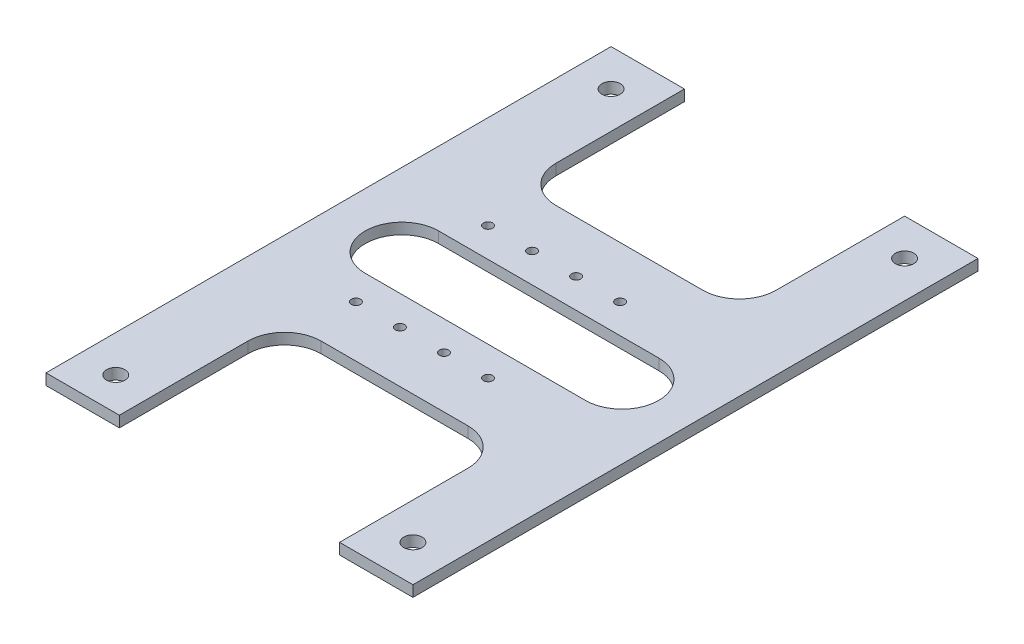
ISO-10303-21;
HEADER;
FILE_DESCRIPTION(('STEP AP214'),'2;1');
FILE_NAME('part.step','',(''),(''),'','','');
FILE_SCHEMA(('AUTOMOTIVE_DESIGN { 1 0 10303 214 1 1 1 1 }'));
ENDSEC;
DATA;
#1=APPLICATION_CONTEXT('core data for automotive mechanical design processes');
#2=APPLICATION_PROTOCOL_DEFINITION('international standard','automotive_design',2000,#1);
#3=PRODUCT_CONTEXT('',#1,'mechanical');
#4=PRODUCT('Part','Part','',(#3));
#5=PRODUCT_RELATED_PRODUCT_CATEGORY('part','',(#4));
#6=PRODUCT_DEFINITION_FORMATION('','',#4);
#7=PRODUCT_DEFINITION_CONTEXT('part definition',#1,'design');
#8=PRODUCT_DEFINITION('design','',#6,#7);
#9=PRODUCT_DEFINITION_SHAPE('','',#8);
#10=(LENGTH_UNIT() NAMED_UNIT(*) SI_UNIT(.MILLI.,.METRE.));
#11=(NAMED_UNIT(*) PLANE_ANGLE_UNIT() SI_UNIT($,.RADIAN.));
#12=(NAMED_UNIT(*) SI_UNIT($,.STERADIAN.) SOLID_ANGLE_UNIT());
#13=UNCERTAINTY_MEASURE_WITH_UNIT(LENGTH_MEASURE(1.E-05),#10,'distance_accuracy_value','');
#14=(GEOMETRIC_REPRESENTATION_CONTEXT(3) GLOBAL_UNCERTAINTY_ASSIGNED_CONTEXT((#13)) GLOBAL_UNIT_ASSIGNED_CONTEXT((#10,
#11,#12)) REPRESENTATION_CONTEXT('',''));
#15=CARTESIAN_POINT('',(0.,0.,0.));
#16=DIRECTION('',(0.,0.,1.));
#17=DIRECTION('',(1.,0.,0.));
#18=AXIS2_PLACEMENT_3D('',#15,#16,#17);
#19=CARTESIAN_POINT('',(944.32799999999,-12.6918888385529,232.973817187622));
#20=DIRECTION('',(0.,0.,-1.));
#21=DIRECTION('',(-1.,0.,0.));
#22=AXIS2_PLACEMENT_3D('',#19,#20,#21);
#23=PLANE('',#22);
#24=DIRECTION('',(1.,0.,0.));
#25=VECTOR('',#24,1.);
#26=CARTESIAN_POINT('',(944.32799999999,-15.6918888385529,232.973817187622));
#27=LINE('',#26,#25);
#28=CARTESIAN_POINT('',(944.32799999999,-15.6918888385529,232.973817187622));
#29=VERTEX_POINT('',#28);
#30=CARTESIAN_POINT('',(964.32799999999,-15.6918888385529,232.973817187622));
#31=VERTEX_POINT('',#30);
#32=EDGE_CURVE('E347',#29,#31,#27,.T.);
#33=ORIENTED_EDGE('',*,*,#32,.T.);
#34=DIRECTION('',(0.,1.,0.));
#35=VECTOR('',#34,1.);
#36=CARTESIAN_POINT('',(964.32799999999,-12.6918888385529,232.973817187622));
#37=LINE('',#36,#35);
#38=CARTESIAN_POINT('',(964.32799999999,-12.6918888385529,232.973817187622));
#39=VERTEX_POINT('',#38);
#40=EDGE_CURVE('E375',#31,#39,#37,.T.);
#41=ORIENTED_EDGE('',*,*,#40,.T.);
#42=DIRECTION('',(1.,0.,0.));
#43=VECTOR('',#42,1.);
#44=CARTESIAN_POINT('',(944.32799999999,-12.6918888385529,232.973817187622));
#45=LINE('',#44,#43);
#46=CARTESIAN_POINT('',(944.32799999999,-12.6918888385529,232.973817187622));
#47=VERTEX_POINT('',#46);
#48=EDGE_CURVE('E334',#47,#39,#45,.T.);
#49=ORIENTED_EDGE('',*,*,#48,.F.);
#50=DIRECTION('',(0.,-1.,0.));
#51=VECTOR('',#50,1.);
#52=CARTESIAN_POINT('',(944.32799999999,-12.6918888385529,232.973817187622));
#53=LINE('',#52,#51);
#54=EDGE_CURVE('E363',#47,#29,#53,.T.);
#55=ORIENTED_EDGE('',*,*,#54,.T.);
#56=EDGE_LOOP('',(#33,#41,#49,#55));
#57=FACE_BOUND('',#56,.T.);
#58=ADVANCED_FACE('F35',(#57),#23,.F.);
#59=CARTESIAN_POINT('',(944.32799999999,-12.6918888385529,78.9738171876227));
#60=DIRECTION('',(0.,0.,1.));
#61=DIRECTION('',(1.,0.,0.));
#62=AXIS2_PLACEMENT_3D('',#59,#60,#61);
#63=PLANE('',#62);
#64=DIRECTION('',(-1.,0.,0.));
#65=VECTOR('',#64,1.);
#66=CARTESIAN_POINT('',(944.32799999999,-12.6918888385529,78.9738171876227));
#67=LINE('',#66,#65);
#68=CARTESIAN_POINT('',(964.32799999999,-12.6918888385529,78.9738171876227));
#69=VERTEX_POINT('',#68);
#70=CARTESIAN_POINT('',(944.32799999999,-12.6918888385529,78.9738171876227));
#71=VERTEX_POINT('',#70);
#72=EDGE_CURVE('E339',#69,#71,#67,.T.);
#73=ORIENTED_EDGE('',*,*,#72,.F.);
#74=DIRECTION('',(0.,-1.,0.));
#75=VECTOR('',#74,1.);
#76=CARTESIAN_POINT('',(964.32799999999,-12.6918888385529,78.9738171876227));
#77=LINE('',#76,#75);
#78=CARTESIAN_POINT('',(964.32799999999,-15.6918888385529,78.9738171876227));
#79=VERTEX_POINT('',#78);
#80=EDGE_CURVE('E369',#69,#79,#77,.T.);
#81=ORIENTED_EDGE('',*,*,#80,.T.);
#82=DIRECTION('',(-1.,0.,0.));
#83=VECTOR('',#82,1.);
#84=CARTESIAN_POINT('',(944.32799999999,-15.6918888385529,78.9738171876227));
#85=LINE('',#84,#83);
#86=CARTESIAN_POINT('',(944.32799999999,-15.6918888385529,78.9738171876227));
#87=VERTEX_POINT('',#86);
#88=EDGE_CURVE('E352',#79,#87,#85,.T.);
#89=ORIENTED_EDGE('',*,*,#88,.T.);
#90=DIRECTION('',(0.,-1.,0.));
#91=VECTOR('',#90,1.);
#92=CARTESIAN_POINT('',(944.32799999999,-12.6918888385529,78.9738171876227));
#93=LINE('',#92,#91);
#94=EDGE_CURVE('E343',#71,#87,#93,.T.);
#95=ORIENTED_EDGE('',*,*,#94,.F.);
#96=EDGE_LOOP('',(#73,#81,#89,#95));
#97=FACE_BOUND('',#96,.T.);
#98=ADVANCED_FACE('F420',(#97),#63,.F.);
#99=CARTESIAN_POINT('',(0.,-12.6918888385529,0.));
#100=DIRECTION('',(0.,1.,0.));
#101=DIRECTION('',(0.,0.,1.));
#102=AXIS2_PLACEMENT_3D('',#99,#100,#101);
#103=PLANE('',#102);
#104=CARTESIAN_POINT('',(964.32799999999,-12.6918888385529,155.973817187622));
#105=DIRECTION('',(0.,1.,0.));
#106=DIRECTION('',(0.,0.,1.));
#107=AXIS2_PLACEMENT_3D('',#104,#105,#106);
#108=CIRCLE('',#107,10.);
#109=CARTESIAN_POINT('',(964.32799999999,-12.6918888385529,145.973817187622));
#110=VERTEX_POINT('',#109);
#111=CARTESIAN_POINT('',(964.32799999999,-12.6918888385529,165.973817187622));
#112=VERTEX_POINT('',#111);
#113=EDGE_CURVE('E50',#110,#112,#108,.T.);
#114=ORIENTED_EDGE('',*,*,#113,.F.);
#115=DIRECTION('',(-1.,0.,0.));
#116=VECTOR('',#115,1.);
#117=CARTESIAN_POINT('',(964.32799999999,-12.6918888385529,145.973817187622));
#118=LINE('',#117,#116);
#119=CARTESIAN_POINT('',(1024.32799999999,-12.6918888385529,145.973817187622));
#120=VERTEX_POINT('',#119);
#121=EDGE_CURVE('E191',#120,#110,#118,.T.);
#122=ORIENTED_EDGE('',*,*,#121,.F.);
#123=CARTESIAN_POINT('',(1024.32799999999,-12.6918888385529,155.973817187622));
#124=DIRECTION('',(0.,1.,0.));
#125=DIRECTION('',(0.,0.,1.));
#126=AXIS2_PLACEMENT_3D('',#123,#124,#125);
#127=CIRCLE('',#126,10.);
#128=CARTESIAN_POINT('',(1024.32799999999,-12.6918888385529,165.973817187622));
#129=VERTEX_POINT('',#128);
#130=EDGE_CURVE('E175',#129,#120,#127,.T.);
#131=ORIENTED_EDGE('',*,*,#130,.F.);
#132=DIRECTION('',(1.,0.,0.));
#133=VECTOR('',#132,1.);
#134=CARTESIAN_POINT('',(964.32799999999,-12.6918888385529,165.973817187622));
#135=LINE('',#134,#133);
#136=EDGE_CURVE('E184',#112,#129,#135,.T.);
#137=ORIENTED_EDGE('',*,*,#136,.F.);
#138=EDGE_LOOP('',(#114,#122,#131,#137));
#139=FACE_BOUND('',#138,.T.);
#140=DIRECTION('',(0.,0.,1.));
#141=VECTOR('',#140,1.);
#142=CARTESIAN_POINT('',(964.32799999999,-12.6918888385529,78.8756281646974));
#143=LINE('',#142,#141);
#144=CARTESIAN_POINT('',(964.32799999999,-12.6918888385529,113.973817187623));
#145=VERTEX_POINT('',#144);
#146=EDGE_CURVE('E201',#69,#145,#143,.T.);
#147=ORIENTED_EDGE('',*,*,#146,.F.);
#148=ORIENTED_EDGE('',*,*,#72,.T.);
#149=DIRECTION('',(0.,0.,1.));
#150=VECTOR('',#149,1.);
#151=CARTESIAN_POINT('',(944.32799999999,-12.6918888385529,78.9738171876227));
#152=LINE('',#151,#150);
#153=EDGE_CURVE('E329',#71,#47,#152,.T.);
#154=ORIENTED_EDGE('',*,*,#153,.T.);
#155=ORIENTED_EDGE('',*,*,#48,.T.);
#156=DIRECTION('',(0.,0.,1.));
#157=VECTOR('',#156,1.);
#158=CARTESIAN_POINT('',(964.32799999999,-12.6918888385529,238.398898184874));
#159=LINE('',#158,#157);
#160=CARTESIAN_POINT('',(964.32799999999,-12.6918888385529,197.973817187622));
#161=VERTEX_POINT('',#160);
#162=EDGE_CURVE('E198',#161,#39,#159,.T.);
#163=ORIENTED_EDGE('',*,*,#162,.F.);
#164=CARTESIAN_POINT('',(974.32799999999,-12.6918888385529,197.973817187622));
#165=DIRECTION('',(0.,1.,0.));
#166=DIRECTION('',(0.,0.,-1.));
#167=AXIS2_PLACEMENT_3D('',#164,#165,#166);
#168=CIRCLE('',#167,10.);
#169=CARTESIAN_POINT('',(974.32799999999,-12.6918888385529,187.973817187622));
#170=VERTEX_POINT('',#169);
#171=EDGE_CURVE('E235',#170,#161,#168,.T.);
#172=ORIENTED_EDGE('',*,*,#171,.F.);
#173=DIRECTION('',(-1.,0.,0.));
#174=VECTOR('',#173,1.);
#175=CARTESIAN_POINT('',(974.32799999999,-12.6918888385529,187.973817187622));
#176=LINE('',#175,#174);
#177=CARTESIAN_POINT('',(1014.32799999999,-12.6918888385529,187.973817187622));
#178=VERTEX_POINT('',#177);
#179=EDGE_CURVE('E232',#178,#170,#176,.T.);
#180=ORIENTED_EDGE('',*,*,#179,.F.);
#181=CARTESIAN_POINT('',(1014.32799999999,-12.6918888385529,197.973817187622));
#182=DIRECTION('',(0.,1.,0.));
#183=DIRECTION('',(0.,0.,-1.));
#184=AXIS2_PLACEMENT_3D('',#181,#182,#183);
#185=CIRCLE('',#184,10.);
#186=CARTESIAN_POINT('',(1024.32799999999,-12.6918888385529,197.973817187622));
#187=VERTEX_POINT('',#186);
#188=EDGE_CURVE('E229',#187,#178,#185,.T.);
#189=ORIENTED_EDGE('',*,*,#188,.F.);
#190=DIRECTION('',(0.,0.,-1.));
#191=VECTOR('',#190,1.);
#192=CARTESIAN_POINT('',(1024.32799999999,-12.6918888385529,238.398898184874));
#193=LINE('',#192,#191);
#194=CARTESIAN_POINT('',(1024.32799999999,-12.6918888385529,232.973817187622));
#195=VERTEX_POINT('',#194);
#196=EDGE_CURVE('E226',#195,#187,#193,.T.);
#197=ORIENTED_EDGE('',*,*,#196,.F.);
#198=CARTESIAN_POINT('',(1044.32799999999,-12.6918888385529,232.973817187622));
#199=VERTEX_POINT('',#198);
#200=EDGE_CURVE('E332',#195,#199,#45,.T.);
#201=ORIENTED_EDGE('',*,*,#200,.T.);
#202=DIRECTION('',(0.,0.,-1.));
#203=VECTOR('',#202,1.);
#204=CARTESIAN_POINT('',(1044.32799999999,-12.6918888385529,78.9738171876227));
#205=LINE('',#204,#203);
#206=CARTESIAN_POINT('',(1044.32799999999,-12.6918888385529,78.9738171876227));
#207=VERTEX_POINT('',#206);
#208=EDGE_CURVE('E337',#199,#207,#205,.T.);
#209=ORIENTED_EDGE('',*,*,#208,.T.);
#210=CARTESIAN_POINT('',(1024.32799999999,-12.6918888385529,78.9738171876227));
#211=VERTEX_POINT('',#210);
#212=EDGE_CURVE('E340',#207,#211,#67,.T.);
#213=ORIENTED_EDGE('',*,*,#212,.T.);
#214=DIRECTION('',(0.,0.,-1.));
#215=VECTOR('',#214,1.);
#216=CARTESIAN_POINT('',(1024.32799999999,-12.6918888385529,78.8756281646974));
#217=LINE('',#216,#215);
#218=CARTESIAN_POINT('',(1024.32799999999,-12.6918888385529,113.973817187623));
#219=VERTEX_POINT('',#218);
#220=EDGE_CURVE('E214',#219,#211,#217,.T.);
#221=ORIENTED_EDGE('',*,*,#220,.F.);
#222=CARTESIAN_POINT('',(1014.32799999999,-12.6918888385529,113.973817187623));
#223=DIRECTION('',(0.,1.,0.));
#224=DIRECTION('',(0.,0.,1.));
#225=AXIS2_PLACEMENT_3D('',#222,#223,#224);
#226=CIRCLE('',#225,9.99999999999999);
#227=CARTESIAN_POINT('',(1014.32799999999,-12.6918888385529,123.973817187623));
#228=VERTEX_POINT('',#227);
#229=EDGE_CURVE('E211',#228,#219,#226,.T.);
#230=ORIENTED_EDGE('',*,*,#229,.F.);
#231=DIRECTION('',(1.,0.,0.));
#232=VECTOR('',#231,1.);
#233=CARTESIAN_POINT('',(974.32799999999,-12.6918888385529,123.973817187623));
#234=LINE('',#233,#232);
#235=CARTESIAN_POINT('',(974.32799999999,-12.6918888385529,123.973817187623));
#236=VERTEX_POINT('',#235);
#237=EDGE_CURVE('E208',#236,#228,#234,.T.);
#238=ORIENTED_EDGE('',*,*,#237,.F.);
#239=CARTESIAN_POINT('',(974.32799999999,-12.6918888385529,113.973817187623));
#240=DIRECTION('',(0.,1.,0.));
#241=DIRECTION('',(0.,0.,1.));
#242=AXIS2_PLACEMENT_3D('',#239,#240,#241);
#243=CIRCLE('',#242,10.);
#244=EDGE_CURVE('E204',#145,#236,#243,.T.);
#245=ORIENTED_EDGE('',*,*,#244,.F.);
#246=EDGE_LOOP('',(#147,#148,#154,#155,#163,#172,#180,#189,#197,#201,#209,#213,#221,#230,#238,#245));
#247=FACE_BOUND('',#246,.T.);
#248=CARTESIAN_POINT('',(1005.80103483829,-12.6918888385529,137.973817187623));
#249=DIRECTION('',(0.,1.,0.));
#250=DIRECTION('',(0.,0.,1.));
#251=AXIS2_PLACEMENT_3D('',#248,#249,#250);
#252=CIRCLE('',#251,1.25000000000006);
#253=CARTESIAN_POINT('',(1005.80103483829,-12.6918888385529,139.223817187623));
#254=VERTEX_POINT('',#253);
#255=EDGE_CURVE('E279',#254,#254,#252,.T.);
#256=ORIENTED_EDGE('',*,*,#255,.F.);
#257=EDGE_LOOP('',(#256));
#258=FACE_BOUND('',#257,.T.);
#259=CARTESIAN_POINT('',(1005.80103483829,-12.6918888385529,173.973817187622));
#260=DIRECTION('',(0.,1.,0.));
#261=DIRECTION('',(0.,0.,1.));
#262=AXIS2_PLACEMENT_3D('',#259,#260,#261);
#263=CIRCLE('',#262,1.24999999999983);
#264=CARTESIAN_POINT('',(1005.80103483829,-12.6918888385529,175.223817187622));
#265=VERTEX_POINT('',#264);
#266=EDGE_CURVE('E285',#265,#265,#263,.T.);
#267=ORIENTED_EDGE('',*,*,#266,.F.);
#268=EDGE_LOOP('',(#267));
#269=FACE_BOUND('',#268,.T.);
#270=CARTESIAN_POINT('',(969.801034838288,-12.6918888385529,173.973817187622));
#271=DIRECTION('',(0.,1.,0.));
#272=DIRECTION('',(0.,0.,1.));
#273=AXIS2_PLACEMENT_3D('',#270,#271,#272);
#274=CIRCLE('',#273,1.24999999999996);
#275=CARTESIAN_POINT('',(969.801034838288,-12.6918888385529,175.223817187622));
#276=VERTEX_POINT('',#275);
#277=EDGE_CURVE('E291',#276,#276,#274,.T.);
#278=ORIENTED_EDGE('',*,*,#277,.F.);
#279=EDGE_LOOP('',(#278));
#280=FACE_BOUND('',#279,.T.);
#281=CARTESIAN_POINT('',(993.801034838288,-12.6918888385529,137.973817187622));
#282=DIRECTION('',(0.,1.,0.));
#283=DIRECTION('',(0.,0.,1.));
#284=AXIS2_PLACEMENT_3D('',#281,#282,#283);
#285=CIRCLE('',#284,1.25000000000007);
#286=CARTESIAN_POINT('',(993.801034838288,-12.6918888385529,139.223817187622));
#287=VERTEX_POINT('',#286);
#288=EDGE_CURVE('E260',#287,#287,#285,.T.);
#289=ORIENTED_EDGE('',*,*,#288,.F.);
#290=EDGE_LOOP('',(#289));
#291=FACE_BOUND('',#290,.T.);
#292=CARTESIAN_POINT('',(981.801034838288,-12.6918888385529,137.973817187622));
#293=DIRECTION('',(0.,1.,0.));
#294=DIRECTION('',(0.,0.,1.));
#295=AXIS2_PLACEMENT_3D('',#292,#293,#294);
#296=CIRCLE('',#295,1.25000000000007);
#297=CARTESIAN_POINT('',(981.801034838288,-12.6918888385529,139.223817187622));
#298=VERTEX_POINT('',#297);
#299=EDGE_CURVE('E261',#298,#298,#296,.T.);
#300=ORIENTED_EDGE('',*,*,#299,.F.);
#301=EDGE_LOOP('',(#300));
#302=FACE_BOUND('',#301,.T.);
#303=CARTESIAN_POINT('',(981.801034838288,-12.6918888385529,173.973817187622));
#304=DIRECTION('',(0.,1.,0.));
#305=DIRECTION('',(0.,0.,1.));
#306=AXIS2_PLACEMENT_3D('',#303,#304,#305);
#307=CIRCLE('',#306,1.25000000000007);
#308=CARTESIAN_POINT('',(981.801034838288,-12.6918888385529,175.223817187622));
#309=VERTEX_POINT('',#308);
#310=EDGE_CURVE('E267',#309,#309,#307,.T.);
#311=ORIENTED_EDGE('',*,*,#310,.F.);
#312=EDGE_LOOP('',(#311));
#313=FACE_BOUND('',#312,.T.);
#314=CARTESIAN_POINT('',(993.801034838288,-12.6918888385529,173.973817187622));
#315=DIRECTION('',(0.,1.,0.));
#316=DIRECTION('',(0.,0.,1.));
#317=AXIS2_PLACEMENT_3D('',#314,#315,#316);
#318=CIRCLE('',#317,1.24999999999984);
#319=CARTESIAN_POINT('',(993.801034838288,-12.6918888385529,175.223817187622));
#320=VERTEX_POINT('',#319);
#321=EDGE_CURVE('E256',#320,#320,#318,.T.);
#322=ORIENTED_EDGE('',*,*,#321,.F.);
#323=EDGE_LOOP('',(#322));
#324=FACE_BOUND('',#323,.T.);
#325=CARTESIAN_POINT('',(969.801034838288,-12.6918888385529,137.973817187622));
#326=DIRECTION('',(0.,1.,0.));
#327=DIRECTION('',(0.,0.,1.));
#328=AXIS2_PLACEMENT_3D('',#325,#326,#327);
#329=CIRCLE('',#328,1.24999999999996);
#330=CARTESIAN_POINT('',(969.801034838288,-12.6918888385529,139.223817187622));
#331=VERTEX_POINT('',#330);
#332=EDGE_CURVE('E278',#331,#331,#329,.T.);
#333=ORIENTED_EDGE('',*,*,#332,.F.);
#334=EDGE_LOOP('',(#333));
#335=FACE_BOUND('',#334,.T.);
#336=CARTESIAN_POINT('',(954.32799999999,-12.6918888385529,223.956502663516));
#337=DIRECTION('',(0.,1.,0.));
#338=DIRECTION('',(0.,0.,1.));
#339=AXIS2_PLACEMENT_3D('',#336,#337,#338);
#340=CIRCLE('',#339,2.50000000005261);
#341=CARTESIAN_POINT('',(954.32799999999,-12.6918888385529,226.456502663569));
#342=VERTEX_POINT('',#341);
#343=EDGE_CURVE('E311',#342,#342,#340,.T.);
#344=ORIENTED_EDGE('',*,*,#343,.F.);
#345=EDGE_LOOP('',(#344));
#346=FACE_BOUND('',#345,.T.);
#347=CARTESIAN_POINT('',(1034.32799999999,-12.6918888385529,88.9738171876226));
#348=DIRECTION('',(0.,1.,0.));
#349=DIRECTION('',(0.,0.,1.));
#350=AXIS2_PLACEMENT_3D('',#347,#348,#349);
#351=CIRCLE('',#350,2.50000000000775);
#352=CARTESIAN_POINT('',(1034.32799999999,-12.6918888385529,91.4738171876304));
#353=VERTEX_POINT('',#352);
#354=EDGE_CURVE('E323',#353,#353,#351,.T.);
#355=ORIENTED_EDGE('',*,*,#354,.F.);
#356=EDGE_LOOP('',(#355));
#357=FACE_BOUND('',#356,.T.);
#358=CARTESIAN_POINT('',(1034.32799999999,-12.6918888385529,222.973817187622));
#359=DIRECTION('',(0.,1.,0.));
#360=DIRECTION('',(0.,0.,1.));
#361=AXIS2_PLACEMENT_3D('',#358,#359,#360);
#362=CIRCLE('',#361,2.50000000000775);
#363=CARTESIAN_POINT('',(1034.32799999999,-12.6918888385529,225.47381718763));
#364=VERTEX_POINT('',#363);
#365=EDGE_CURVE('E317',#364,#364,#362,.T.);
#366=ORIENTED_EDGE('',*,*,#365,.F.);
#367=EDGE_LOOP('',(#366));
#368=FACE_BOUND('',#367,.T.);
#369=CARTESIAN_POINT('',(954.32799999999,-12.6918888385529,88.9738171876226));
#370=DIRECTION('',(0.,1.,0.));
#371=DIRECTION('',(0.,0.,1.));
#372=AXIS2_PLACEMENT_3D('',#369,#370,#371);
#373=CIRCLE('',#372,2.50000000000775);
#374=CARTESIAN_POINT('',(954.32799999999,-12.6918888385529,91.4738171876304));
#375=VERTEX_POINT('',#374);
#376=EDGE_CURVE('E305',#375,#375,#373,.T.);
#377=ORIENTED_EDGE('',*,*,#376,.F.);
#378=EDGE_LOOP('',(#377));
#379=FACE_BOUND('',#378,.T.);
#380=ADVANCED_FACE('F188',(#139,#247,#258,#269,#280,#291,#302,#313,#324,#335,#346,#357,#368,
#379),#103,.T.);
#381=CARTESIAN_POINT('',(0.,-15.6918888385529,0.));
#382=DIRECTION('',(0.,1.,0.));
#383=DIRECTION('',(0.,0.,1.));
#384=AXIS2_PLACEMENT_3D('',#381,#382,#383);
#385=PLANE('',#384);
#386=DIRECTION('',(-1.,0.,0.));
#387=VECTOR('',#386,1.);
#388=CARTESIAN_POINT('',(0.,-15.6918888385529,145.973817187622));
#389=LINE('',#388,#387);
#390=CARTESIAN_POINT('',(1024.32799999999,-15.6918888385529,145.973817187622));
#391=VERTEX_POINT('',#390);
#392=CARTESIAN_POINT('',(964.32799999999,-15.6918888385529,145.973817187622));
#393=VERTEX_POINT('',#392);
#394=EDGE_CURVE('E43',#391,#393,#389,.T.);
#395=ORIENTED_EDGE('',*,*,#394,.T.);
#396=CARTESIAN_POINT('',(964.32799999999,-15.6918888385529,155.973817187622));
#397=DIRECTION('',(0.,1.,0.));
#398=DIRECTION('',(0.,0.,1.));
#399=AXIS2_PLACEMENT_3D('',#396,#397,#398);
#400=CIRCLE('',#399,10.);
#401=CARTESIAN_POINT('',(964.32799999999,-15.6918888385529,165.973817187622));
#402=VERTEX_POINT('',#401);
#403=EDGE_CURVE('E11',#393,#402,#400,.T.);
#404=ORIENTED_EDGE('',*,*,#403,.T.);
#405=DIRECTION('',(1.,0.,0.));
#406=VECTOR('',#405,1.);
#407=CARTESIAN_POINT('',(0.,-15.6918888385529,165.973817187622));
#408=LINE('',#407,#406);
#409=CARTESIAN_POINT('',(1024.32799999999,-15.6918888385529,165.973817187622));
#410=VERTEX_POINT('',#409);
#411=EDGE_CURVE('E396',#402,#410,#408,.T.);
#412=ORIENTED_EDGE('',*,*,#411,.T.);
#413=CARTESIAN_POINT('',(1024.32799999999,-15.6918888385529,155.973817187622));
#414=DIRECTION('',(0.,1.,0.));
#415=DIRECTION('',(0.,0.,1.));
#416=AXIS2_PLACEMENT_3D('',#413,#414,#415);
#417=CIRCLE('',#416,10.);
#418=EDGE_CURVE('E178',#410,#391,#417,.T.);
#419=ORIENTED_EDGE('',*,*,#418,.T.);
#420=EDGE_LOOP('',(#395,#404,#412,#419));
#421=FACE_BOUND('',#420,.T.);
#422=ORIENTED_EDGE('',*,*,#88,.F.);
#423=DIRECTION('',(0.,0.,1.));
#424=VECTOR('',#423,1.);
#425=CARTESIAN_POINT('',(964.32799999999,-15.6918888385529,0.));
#426=LINE('',#425,#424);
#427=CARTESIAN_POINT('',(964.32799999999,-15.6918888385529,113.973817187623));
#428=VERTEX_POINT('',#427);
#429=EDGE_CURVE('E247',#79,#428,#426,.T.);
#430=ORIENTED_EDGE('',*,*,#429,.T.);
#431=CARTESIAN_POINT('',(974.32799999999,-15.6918888385529,113.973817187623));
#432=DIRECTION('',(0.,1.,0.));
#433=DIRECTION('',(0.,0.,1.));
#434=AXIS2_PLACEMENT_3D('',#431,#432,#433);
#435=CIRCLE('',#434,10.);
#436=CARTESIAN_POINT('',(974.32799999999,-15.6918888385529,123.973817187623));
#437=VERTEX_POINT('',#436);
#438=EDGE_CURVE('E387',#428,#437,#435,.T.);
#439=ORIENTED_EDGE('',*,*,#438,.T.);
#440=DIRECTION('',(1.,0.,0.));
#441=VECTOR('',#440,1.);
#442=CARTESIAN_POINT('',(0.,-15.6918888385529,123.973817187623));
#443=LINE('',#442,#441);
#444=CARTESIAN_POINT('',(1014.32799999999,-15.6918888385529,123.973817187623));
#445=VERTEX_POINT('',#444);
#446=EDGE_CURVE('E390',#437,#445,#443,.T.);
#447=ORIENTED_EDGE('',*,*,#446,.T.);
#448=CARTESIAN_POINT('',(1014.32799999999,-15.6918888385529,113.973817187623));
#449=DIRECTION('',(0.,1.,0.));
#450=DIRECTION('',(0.,0.,1.));
#451=AXIS2_PLACEMENT_3D('',#448,#449,#450);
#452=CIRCLE('',#451,9.99999999999999);
#453=CARTESIAN_POINT('',(1024.32799999999,-15.6918888385529,113.973817187623));
#454=VERTEX_POINT('',#453);
#455=EDGE_CURVE('E393',#445,#454,#452,.T.);
#456=ORIENTED_EDGE('',*,*,#455,.T.);
#457=DIRECTION('',(0.,0.,-1.));
#458=VECTOR('',#457,1.);
#459=CARTESIAN_POINT('',(1024.32799999999,-15.6918888385529,0.));
#460=LINE('',#459,#458);
#461=CARTESIAN_POINT('',(1024.32799999999,-15.6918888385529,78.9738171876227));
#462=VERTEX_POINT('',#461);
#463=EDGE_CURVE('E219',#454,#462,#460,.T.);
#464=ORIENTED_EDGE('',*,*,#463,.T.);
#465=CARTESIAN_POINT('',(1044.32799999999,-15.6918888385529,78.9738171876227));
#466=VERTEX_POINT('',#465);
#467=EDGE_CURVE('E333',#466,#462,#85,.T.);
#468=ORIENTED_EDGE('',*,*,#467,.F.);
#469=DIRECTION('',(0.,0.,-1.));
#470=VECTOR('',#469,1.);
#471=CARTESIAN_POINT('',(1044.32799999999,-15.6918888385529,78.9738171876227));
#472=LINE('',#471,#470);
#473=CARTESIAN_POINT('',(1044.32799999999,-15.6918888385529,232.973817187622));
#474=VERTEX_POINT('',#473);
#475=EDGE_CURVE('E350',#474,#466,#472,.T.);
#476=ORIENTED_EDGE('',*,*,#475,.F.);
#477=CARTESIAN_POINT('',(1024.32799999999,-15.6918888385529,232.973817187622));
#478=VERTEX_POINT('',#477);
#479=EDGE_CURVE('E346',#478,#474,#27,.T.);
#480=ORIENTED_EDGE('',*,*,#479,.F.);
#481=DIRECTION('',(0.,0.,-1.));
#482=VECTOR('',#481,1.);
#483=CARTESIAN_POINT('',(1024.32799999999,-15.6918888385529,0.));
#484=LINE('',#483,#482);
#485=CARTESIAN_POINT('',(1024.32799999999,-15.6918888385529,197.973817187622));
#486=VERTEX_POINT('',#485);
#487=EDGE_CURVE('E250',#478,#486,#484,.T.);
#488=ORIENTED_EDGE('',*,*,#487,.T.);
#489=CARTESIAN_POINT('',(1014.32799999999,-15.6918888385529,197.973817187622));
#490=DIRECTION('',(0.,1.,0.));
#491=DIRECTION('',(0.,0.,1.));
#492=AXIS2_PLACEMENT_3D('',#489,#490,#491);
#493=CIRCLE('',#492,10.);
#494=CARTESIAN_POINT('',(1014.32799999999,-15.6918888385529,187.973817187622));
#495=VERTEX_POINT('',#494);
#496=EDGE_CURVE('E378',#486,#495,#493,.T.);
#497=ORIENTED_EDGE('',*,*,#496,.T.);
#498=DIRECTION('',(-1.,0.,0.));
#499=VECTOR('',#498,1.);
#500=CARTESIAN_POINT('',(0.,-15.6918888385529,187.973817187622));
#501=LINE('',#500,#499);
#502=CARTESIAN_POINT('',(974.32799999999,-15.6918888385529,187.973817187622));
#503=VERTEX_POINT('',#502);
#504=EDGE_CURVE('E381',#495,#503,#501,.T.);
#505=ORIENTED_EDGE('',*,*,#504,.T.);
#506=CARTESIAN_POINT('',(974.32799999999,-15.6918888385529,197.973817187622));
#507=DIRECTION('',(0.,1.,0.));
#508=DIRECTION('',(0.,0.,1.));
#509=AXIS2_PLACEMENT_3D('',#506,#507,#508);
#510=CIRCLE('',#509,10.);
#511=CARTESIAN_POINT('',(964.32799999999,-15.6918888385529,197.973817187622));
#512=VERTEX_POINT('',#511);
#513=EDGE_CURVE('E384',#503,#512,#510,.T.);
#514=ORIENTED_EDGE('',*,*,#513,.T.);
#515=DIRECTION('',(0.,0.,1.));
#516=VECTOR('',#515,1.);
#517=CARTESIAN_POINT('',(964.32799999999,-15.6918888385529,0.));
#518=LINE('',#517,#516);
#519=EDGE_CURVE('E253',#512,#31,#518,.T.);
#520=ORIENTED_EDGE('',*,*,#519,.T.);
#521=ORIENTED_EDGE('',*,*,#32,.F.);
#522=DIRECTION('',(0.,0.,1.));
#523=VECTOR('',#522,1.);
#524=CARTESIAN_POINT('',(944.32799999999,-15.6918888385529,78.9738171876227));
#525=LINE('',#524,#523);
#526=EDGE_CURVE('E326',#87,#29,#525,.T.);
#527=ORIENTED_EDGE('',*,*,#526,.F.);
#528=EDGE_LOOP('',(#422,#430,#439,#447,#456,#464,#468,#476,#480,#488,#497,#505,#514,#520,#521,#527));
#529=FACE_BOUND('',#528,.T.);
#530=CARTESIAN_POINT('',(1005.80103483829,-15.6918888385529,137.973817187623));
#531=DIRECTION('',(0.,1.,0.));
#532=DIRECTION('',(0.,0.,1.));
#533=AXIS2_PLACEMENT_3D('',#530,#531,#532);
#534=CIRCLE('',#533,1.25000000000006);
#535=CARTESIAN_POINT('',(1005.80103483829,-15.6918888385529,139.223817187623));
#536=VERTEX_POINT('',#535);
#537=EDGE_CURVE('E275',#536,#536,#534,.T.);
#538=ORIENTED_EDGE('',*,*,#537,.T.);
#539=EDGE_LOOP('',(#538));
#540=FACE_BOUND('',#539,.T.);
#541=CARTESIAN_POINT('',(1005.80103483829,-15.6918888385529,173.973817187622));
#542=DIRECTION('',(0.,1.,0.));
#543=DIRECTION('',(0.,0.,1.));
#544=AXIS2_PLACEMENT_3D('',#541,#542,#543);
#545=CIRCLE('',#544,1.24999999999983);
#546=CARTESIAN_POINT('',(1005.80103483829,-15.6918888385529,175.223817187622));
#547=VERTEX_POINT('',#546);
#548=EDGE_CURVE('E282',#547,#547,#545,.T.);
#549=ORIENTED_EDGE('',*,*,#548,.T.);
#550=EDGE_LOOP('',(#549));
#551=FACE_BOUND('',#550,.T.);
#552=CARTESIAN_POINT('',(969.801034838288,-15.6918888385529,173.973817187622));
#553=DIRECTION('',(0.,1.,0.));
#554=DIRECTION('',(0.,0.,1.));
#555=AXIS2_PLACEMENT_3D('',#552,#553,#554);
#556=CIRCLE('',#555,1.24999999999996);
#557=CARTESIAN_POINT('',(969.801034838288,-15.6918888385529,175.223817187622));
#558=VERTEX_POINT('',#557);
#559=EDGE_CURVE('E288',#558,#558,#556,.T.);
#560=ORIENTED_EDGE('',*,*,#559,.T.);
#561=EDGE_LOOP('',(#560));
#562=FACE_BOUND('',#561,.T.);
#563=CARTESIAN_POINT('',(993.801034838288,-15.6918888385529,137.973817187622));
#564=DIRECTION('',(0.,1.,0.));
#565=DIRECTION('',(0.,0.,1.));
#566=AXIS2_PLACEMENT_3D('',#563,#564,#565);
#567=CIRCLE('',#566,1.25000000000007);
#568=CARTESIAN_POINT('',(993.801034838288,-15.6918888385529,139.223817187622));
#569=VERTEX_POINT('',#568);
#570=EDGE_CURVE('E294',#569,#569,#567,.T.);
#571=ORIENTED_EDGE('',*,*,#570,.T.);
#572=EDGE_LOOP('',(#571));
#573=FACE_BOUND('',#572,.T.);
#574=CARTESIAN_POINT('',(981.801034838288,-15.6918888385529,137.973817187622));
#575=DIRECTION('',(0.,1.,0.));
#576=DIRECTION('',(0.,0.,1.));
#577=AXIS2_PLACEMENT_3D('',#574,#575,#576);
#578=CIRCLE('',#577,1.25000000000007);
#579=CARTESIAN_POINT('',(981.801034838288,-15.6918888385529,139.223817187622));
#580=VERTEX_POINT('',#579);
#581=EDGE_CURVE('E257',#580,#580,#578,.T.);
#582=ORIENTED_EDGE('',*,*,#581,.T.);
#583=EDGE_LOOP('',(#582));
#584=FACE_BOUND('',#583,.T.);
#585=CARTESIAN_POINT('',(981.801034838288,-15.6918888385529,173.973817187622));
#586=DIRECTION('',(0.,1.,0.));
#587=DIRECTION('',(0.,0.,1.));
#588=AXIS2_PLACEMENT_3D('',#585,#586,#587);
#589=CIRCLE('',#588,1.25000000000007);
#590=CARTESIAN_POINT('',(981.801034838288,-15.6918888385529,175.223817187622));
#591=VERTEX_POINT('',#590);
#592=EDGE_CURVE('E264',#591,#591,#589,.T.);
#593=ORIENTED_EDGE('',*,*,#592,.T.);
#594=EDGE_LOOP('',(#593));
#595=FACE_BOUND('',#594,.T.);
#596=CARTESIAN_POINT('',(993.801034838288,-15.6918888385529,173.973817187622));
#597=DIRECTION('',(0.,1.,0.));
#598=DIRECTION('',(0.,0.,1.));
#599=AXIS2_PLACEMENT_3D('',#596,#597,#598);
#600=CIRCLE('',#599,1.24999999999984);
#601=CARTESIAN_POINT('',(993.801034838288,-15.6918888385529,175.223817187622));
#602=VERTEX_POINT('',#601);
#603=EDGE_CURVE('E270',#602,#602,#600,.T.);
#604=ORIENTED_EDGE('',*,*,#603,.T.);
#605=EDGE_LOOP('',(#604));
#606=FACE_BOUND('',#605,.T.);
#607=CARTESIAN_POINT('',(969.801034838288,-15.6918888385529,137.973817187622));
#608=DIRECTION('',(0.,1.,0.));
#609=DIRECTION('',(0.,0.,1.));
#610=AXIS2_PLACEMENT_3D('',#607,#608,#609);
#611=CIRCLE('',#610,1.24999999999996);
#612=CARTESIAN_POINT('',(969.801034838288,-15.6918888385529,139.223817187622));
#613=VERTEX_POINT('',#612);
#614=EDGE_CURVE('E299',#613,#613,#611,.T.);
#615=ORIENTED_EDGE('',*,*,#614,.T.);
#616=EDGE_LOOP('',(#615));
#617=FACE_BOUND('',#616,.T.);
#618=CARTESIAN_POINT('',(1034.32799999999,-15.6918888385529,88.9738171876226));
#619=DIRECTION('',(0.,1.,0.));
#620=DIRECTION('',(0.,0.,1.));
#621=AXIS2_PLACEMENT_3D('',#618,#619,#620);
#622=CIRCLE('',#621,2.50000000000775);
#623=CARTESIAN_POINT('',(1034.32799999999,-15.6918888385529,91.4738171876304));
#624=VERTEX_POINT('',#623);
#625=EDGE_CURVE('E320',#624,#624,#622,.T.);
#626=ORIENTED_EDGE('',*,*,#625,.T.);
#627=EDGE_LOOP('',(#626));
#628=FACE_BOUND('',#627,.T.);
#629=CARTESIAN_POINT('',(1034.32799999999,-15.6918888385529,222.973817187622));
#630=DIRECTION('',(0.,1.,0.));
#631=DIRECTION('',(0.,0.,1.));
#632=AXIS2_PLACEMENT_3D('',#629,#630,#631);
#633=CIRCLE('',#632,2.50000000000775);
#634=CARTESIAN_POINT('',(1034.32799999999,-15.6918888385529,225.47381718763));
#635=VERTEX_POINT('',#634);
#636=EDGE_CURVE('E314',#635,#635,#633,.T.);
#637=ORIENTED_EDGE('',*,*,#636,.T.);
#638=EDGE_LOOP('',(#637));
#639=FACE_BOUND('',#638,.T.);
#640=CARTESIAN_POINT('',(954.32799999999,-15.6918888385529,223.956502663516));
#641=DIRECTION('',(0.,1.,0.));
#642=DIRECTION('',(0.,0.,1.));
#643=AXIS2_PLACEMENT_3D('',#640,#641,#642);
#644=CIRCLE('',#643,2.50000000005261);
#645=CARTESIAN_POINT('',(954.32799999999,-15.6918888385529,226.456502663569));
#646=VERTEX_POINT('',#645);
#647=EDGE_CURVE('E308',#646,#646,#644,.T.);
#648=ORIENTED_EDGE('',*,*,#647,.T.);
#649=EDGE_LOOP('',(#648));
#650=FACE_BOUND('',#649,.T.);
#651=CARTESIAN_POINT('',(954.32799999999,-15.6918888385529,88.9738171876226));
#652=DIRECTION('',(0.,1.,0.));
#653=DIRECTION('',(0.,0.,1.));
#654=AXIS2_PLACEMENT_3D('',#651,#652,#653);
#655=CIRCLE('',#654,2.50000000000775);
#656=CARTESIAN_POINT('',(954.32799999999,-15.6918888385529,91.4738171876304));
#657=VERTEX_POINT('',#656);
#658=EDGE_CURVE('E302',#657,#657,#655,.T.);
#659=ORIENTED_EDGE('',*,*,#658,.T.);
#660=EDGE_LOOP('',(#659));
#661=FACE_BOUND('',#660,.T.);
#662=ADVANCED_FACE('F400',(#421,#529,#540,#551,#562,#573,#584,#595,#606,#617,#628,#639,#650,
#661),#385,.F.);
#663=CARTESIAN_POINT('',(944.32799999999,-12.6918888385529,78.9738171876227));
#664=DIRECTION('',(1.,0.,0.));
#665=DIRECTION('',(0.,0.,-1.));
#666=AXIS2_PLACEMENT_3D('',#663,#664,#665);
#667=PLANE('',#666);
#668=ORIENTED_EDGE('',*,*,#526,.T.);
#669=ORIENTED_EDGE('',*,*,#54,.F.);
#670=ORIENTED_EDGE('',*,*,#153,.F.);
#671=ORIENTED_EDGE('',*,*,#94,.T.);
#672=EDGE_LOOP('',(#668,#669,#670,#671));
#673=FACE_BOUND('',#672,.T.);
#674=ADVANCED_FACE('F37',(#673),#667,.F.);
#675=ORIENTED_EDGE('',*,*,#200,.F.);
#676=DIRECTION('',(0.,-1.,0.));
#677=VECTOR('',#676,1.);
#678=CARTESIAN_POINT('',(1024.32799999999,-12.6918888385529,232.973817187622));
#679=LINE('',#678,#677);
#680=EDGE_CURVE('E372',#195,#478,#679,.T.);
#681=ORIENTED_EDGE('',*,*,#680,.T.);
#682=ORIENTED_EDGE('',*,*,#479,.T.);
#683=DIRECTION('',(0.,-1.,0.));
#684=VECTOR('',#683,1.);
#685=CARTESIAN_POINT('',(1044.32799999999,-12.6918888385529,232.973817187622));
#686=LINE('',#685,#684);
#687=EDGE_CURVE('E360',#199,#474,#686,.T.);
#688=ORIENTED_EDGE('',*,*,#687,.F.);
#689=EDGE_LOOP('',(#675,#681,#682,#688));
#690=FACE_BOUND('',#689,.T.);
#691=ADVANCED_FACE('F422',(#690),#23,.F.);
#692=CARTESIAN_POINT('',(1044.32799999999,-12.6918888385529,78.9738171876227));
#693=DIRECTION('',(-1.,0.,0.));
#694=DIRECTION('',(0.,0.,1.));
#695=AXIS2_PLACEMENT_3D('',#692,#693,#694);
#696=PLANE('',#695);
#697=ORIENTED_EDGE('',*,*,#475,.T.);
#698=DIRECTION('',(0.,-1.,0.));
#699=VECTOR('',#698,1.);
#700=CARTESIAN_POINT('',(1044.32799999999,-12.6918888385529,78.9738171876227));
#701=LINE('',#700,#699);
#702=EDGE_CURVE('E357',#207,#466,#701,.T.);
#703=ORIENTED_EDGE('',*,*,#702,.F.);
#704=ORIENTED_EDGE('',*,*,#208,.F.);
#705=ORIENTED_EDGE('',*,*,#687,.T.);
#706=EDGE_LOOP('',(#697,#703,#704,#705));
#707=FACE_BOUND('',#706,.T.);
#708=ADVANCED_FACE('F431',(#707),#696,.F.);
#709=ORIENTED_EDGE('',*,*,#467,.T.);
#710=DIRECTION('',(0.,1.,0.));
#711=VECTOR('',#710,1.);
#712=CARTESIAN_POINT('',(1024.32799999999,-12.6918888385529,78.9738171876227));
#713=LINE('',#712,#711);
#714=EDGE_CURVE('E366',#462,#211,#713,.T.);
#715=ORIENTED_EDGE('',*,*,#714,.T.);
#716=ORIENTED_EDGE('',*,*,#212,.F.);
#717=ORIENTED_EDGE('',*,*,#702,.T.);
#718=EDGE_LOOP('',(#709,#715,#716,#717));
#719=FACE_BOUND('',#718,.T.);
#720=ADVANCED_FACE('F428',(#719),#63,.F.);
#721=CARTESIAN_POINT('',(1034.32799999999,-12.6918888385529,88.9738171876226));
#722=DIRECTION('',(0.,-1.,0.));
#723=DIRECTION('',(0.,0.,-1.));
#724=AXIS2_PLACEMENT_3D('',#721,#722,#723);
#725=CYLINDRICAL_SURFACE('',#724,2.50000000000775);
#726=ORIENTED_EDGE('',*,*,#354,.T.);
#727=EDGE_LOOP('',(#726));
#728=FACE_BOUND('',#727,.T.);
#729=ORIENTED_EDGE('',*,*,#625,.F.);
#730=EDGE_LOOP('',(#729));
#731=FACE_BOUND('',#730,.T.);
#732=ADVANCED_FACE('F544',(#728,#731),#725,.F.);
#733=CARTESIAN_POINT('',(1034.32799999999,-12.6918888385529,222.973817187622));
#734=DIRECTION('',(0.,-1.,0.));
#735=DIRECTION('',(0.,0.,-1.));
#736=AXIS2_PLACEMENT_3D('',#733,#734,#735);
#737=CYLINDRICAL_SURFACE('',#736,2.50000000000775);
#738=ORIENTED_EDGE('',*,*,#365,.T.);
#739=EDGE_LOOP('',(#738));
#740=FACE_BOUND('',#739,.T.);
#741=ORIENTED_EDGE('',*,*,#636,.F.);
#742=EDGE_LOOP('',(#741));
#743=FACE_BOUND('',#742,.T.);
#744=ADVANCED_FACE('F540',(#740,#743),#737,.F.);
#745=CARTESIAN_POINT('',(954.32799999999,-12.6918888385529,223.956502663516));
#746=DIRECTION('',(0.,-1.,0.));
#747=DIRECTION('',(0.,0.,-1.));
#748=AXIS2_PLACEMENT_3D('',#745,#746,#747);
#749=CYLINDRICAL_SURFACE('',#748,2.50000000005261);
#750=ORIENTED_EDGE('',*,*,#343,.T.);
#751=EDGE_LOOP('',(#750));
#752=FACE_BOUND('',#751,.T.);
#753=ORIENTED_EDGE('',*,*,#647,.F.);
#754=EDGE_LOOP('',(#753));
#755=FACE_BOUND('',#754,.T.);
#756=ADVANCED_FACE('F536',(#752,#755),#749,.F.);
#757=CARTESIAN_POINT('',(954.32799999999,-12.6918888385529,88.9738171876226));
#758=DIRECTION('',(0.,-1.,0.));
#759=DIRECTION('',(0.,0.,-1.));
#760=AXIS2_PLACEMENT_3D('',#757,#758,#759);
#761=CYLINDRICAL_SURFACE('',#760,2.50000000000775);
#762=ORIENTED_EDGE('',*,*,#376,.T.);
#763=EDGE_LOOP('',(#762));
#764=FACE_BOUND('',#763,.T.);
#765=ORIENTED_EDGE('',*,*,#658,.F.);
#766=EDGE_LOOP('',(#765));
#767=FACE_BOUND('',#766,.T.);
#768=ADVANCED_FACE('F532',(#764,#767),#761,.F.);
#769=CARTESIAN_POINT('',(969.801034838288,-15.6918888385529,137.973817187622));
#770=DIRECTION('',(0.,1.,0.));
#771=DIRECTION('',(0.,0.,1.));
#772=AXIS2_PLACEMENT_3D('',#769,#770,#771);
#773=CYLINDRICAL_SURFACE('',#772,1.24999999999996);
#774=ORIENTED_EDGE('',*,*,#614,.F.);
#775=EDGE_LOOP('',(#774));
#776=FACE_BOUND('',#775,.T.);
#777=ORIENTED_EDGE('',*,*,#332,.T.);
#778=EDGE_LOOP('',(#777));
#779=FACE_BOUND('',#778,.T.);
#780=ADVANCED_FACE('F513',(#776,#779),#773,.F.);
#781=CARTESIAN_POINT('',(993.801034838288,-15.6918888385529,173.973817187622));
#782=DIRECTION('',(0.,1.,0.));
#783=DIRECTION('',(0.,0.,1.));
#784=AXIS2_PLACEMENT_3D('',#781,#782,#783);
#785=CYLINDRICAL_SURFACE('',#784,1.24999999999984);
#786=ORIENTED_EDGE('',*,*,#603,.F.);
#787=EDGE_LOOP('',(#786));
#788=FACE_BOUND('',#787,.T.);
#789=ORIENTED_EDGE('',*,*,#321,.T.);
#790=EDGE_LOOP('',(#789));
#791=FACE_BOUND('',#790,.T.);
#792=ADVANCED_FACE('F509',(#788,#791),#785,.F.);
#793=CARTESIAN_POINT('',(981.801034838288,-15.6918888385529,173.973817187622));
#794=DIRECTION('',(0.,1.,0.));
#795=DIRECTION('',(0.,0.,1.));
#796=AXIS2_PLACEMENT_3D('',#793,#794,#795);
#797=CYLINDRICAL_SURFACE('',#796,1.25000000000007);
#798=ORIENTED_EDGE('',*,*,#592,.F.);
#799=EDGE_LOOP('',(#798));
#800=FACE_BOUND('',#799,.T.);
#801=ORIENTED_EDGE('',*,*,#310,.T.);
#802=EDGE_LOOP('',(#801));
#803=FACE_BOUND('',#802,.T.);
#804=ADVANCED_FACE('F505',(#800,#803),#797,.F.);
#805=CARTESIAN_POINT('',(981.801034838288,-15.6918888385529,137.973817187622));
#806=DIRECTION('',(0.,1.,0.));
#807=DIRECTION('',(0.,0.,1.));
#808=AXIS2_PLACEMENT_3D('',#805,#806,#807);
#809=CYLINDRICAL_SURFACE('',#808,1.25000000000007);
#810=ORIENTED_EDGE('',*,*,#581,.F.);
#811=EDGE_LOOP('',(#810));
#812=FACE_BOUND('',#811,.T.);
#813=ORIENTED_EDGE('',*,*,#299,.T.);
#814=EDGE_LOOP('',(#813));
#815=FACE_BOUND('',#814,.T.);
#816=ADVANCED_FACE('F501',(#812,#815),#809,.F.);
#817=CARTESIAN_POINT('',(993.801034838288,-15.6918888385529,137.973817187622));
#818=DIRECTION('',(0.,1.,0.));
#819=DIRECTION('',(0.,0.,1.));
#820=AXIS2_PLACEMENT_3D('',#817,#818,#819);
#821=CYLINDRICAL_SURFACE('',#820,1.25000000000007);
#822=ORIENTED_EDGE('',*,*,#570,.F.);
#823=EDGE_LOOP('',(#822));
#824=FACE_BOUND('',#823,.T.);
#825=ORIENTED_EDGE('',*,*,#288,.T.);
#826=EDGE_LOOP('',(#825));
#827=FACE_BOUND('',#826,.T.);
#828=ADVANCED_FACE('F504',(#824,#827),#821,.F.);
#829=CARTESIAN_POINT('',(969.801034838288,-15.6918888385529,173.973817187622));
#830=DIRECTION('',(0.,1.,0.));
#831=DIRECTION('',(0.,0.,1.));
#832=AXIS2_PLACEMENT_3D('',#829,#830,#831);
#833=CYLINDRICAL_SURFACE('',#832,1.24999999999996);
#834=ORIENTED_EDGE('',*,*,#559,.F.);
#835=EDGE_LOOP('',(#834));
#836=FACE_BOUND('',#835,.T.);
#837=ORIENTED_EDGE('',*,*,#277,.T.);
#838=EDGE_LOOP('',(#837));
#839=FACE_BOUND('',#838,.T.);
#840=ADVANCED_FACE('F522',(#836,#839),#833,.F.);
#841=CARTESIAN_POINT('',(1005.80103483829,-15.6918888385529,173.973817187622));
#842=DIRECTION('',(0.,1.,0.));
#843=DIRECTION('',(0.,0.,1.));
#844=AXIS2_PLACEMENT_3D('',#841,#842,#843);
#845=CYLINDRICAL_SURFACE('',#844,1.24999999999983);
#846=ORIENTED_EDGE('',*,*,#548,.F.);
#847=EDGE_LOOP('',(#846));
#848=FACE_BOUND('',#847,.T.);
#849=ORIENTED_EDGE('',*,*,#266,.T.);
#850=EDGE_LOOP('',(#849));
#851=FACE_BOUND('',#850,.T.);
#852=ADVANCED_FACE('F518',(#848,#851),#845,.F.);
#853=CARTESIAN_POINT('',(1005.80103483829,-15.6918888385529,137.973817187623));
#854=DIRECTION('',(0.,1.,0.));
#855=DIRECTION('',(0.,0.,1.));
#856=AXIS2_PLACEMENT_3D('',#853,#854,#855);
#857=CYLINDRICAL_SURFACE('',#856,1.25000000000006);
#858=ORIENTED_EDGE('',*,*,#537,.F.);
#859=EDGE_LOOP('',(#858));
#860=FACE_BOUND('',#859,.T.);
#861=ORIENTED_EDGE('',*,*,#255,.T.);
#862=EDGE_LOOP('',(#861));
#863=FACE_BOUND('',#862,.T.);
#864=ADVANCED_FACE('F515',(#860,#863),#857,.F.);
#865=CARTESIAN_POINT('',(1014.32799999999,-22.6918888385529,113.973817187623));
#866=DIRECTION('',(0.,1.,0.));
#867=DIRECTION('',(0.,0.,1.));
#868=AXIS2_PLACEMENT_3D('',#865,#866,#867);
#869=CYLINDRICAL_SURFACE('',#868,9.99999999999999);
#870=DIRECTION('',(0.,1.,0.));
#871=VECTOR('',#870,1.);
#872=CARTESIAN_POINT('',(1014.32799999999,-22.6918888385529,123.973817187623));
#873=LINE('',#872,#871);
#874=EDGE_CURVE('E220',#445,#228,#873,.T.);
#875=ORIENTED_EDGE('',*,*,#874,.T.);
#876=ORIENTED_EDGE('',*,*,#229,.T.);
#877=DIRECTION('',(0.,1.,0.));
#878=VECTOR('',#877,1.);
#879=CARTESIAN_POINT('',(1024.32799999999,-22.6918888385529,113.973817187623));
#880=LINE('',#879,#878);
#881=EDGE_CURVE('E217',#454,#219,#880,.T.);
#882=ORIENTED_EDGE('',*,*,#881,.F.);
#883=ORIENTED_EDGE('',*,*,#455,.F.);
#884=EDGE_LOOP('',(#875,#876,#882,#883));
#885=FACE_BOUND('',#884,.T.);
#886=ADVANCED_FACE('F463',(#885),#869,.F.);
#887=CARTESIAN_POINT('',(974.32799999999,-22.6918888385529,123.973817187623));
#888=DIRECTION('',(0.,0.,1.));
#889=DIRECTION('',(1.,0.,0.));
#890=AXIS2_PLACEMENT_3D('',#887,#888,#889);
#891=PLANE('',#890);
#892=DIRECTION('',(0.,1.,0.));
#893=VECTOR('',#892,1.);
#894=CARTESIAN_POINT('',(974.32799999999,-22.6918888385529,123.973817187623));
#895=LINE('',#894,#893);
#896=EDGE_CURVE('E222',#437,#236,#895,.T.);
#897=ORIENTED_EDGE('',*,*,#896,.T.);
#898=ORIENTED_EDGE('',*,*,#237,.T.);
#899=ORIENTED_EDGE('',*,*,#874,.F.);
#900=ORIENTED_EDGE('',*,*,#446,.F.);
#901=EDGE_LOOP('',(#897,#898,#899,#900));
#902=FACE_BOUND('',#901,.T.);
#903=ADVANCED_FACE('F466',(#902),#891,.F.);
#904=CARTESIAN_POINT('',(974.32799999999,-22.6918888385529,113.973817187623));
#905=DIRECTION('',(0.,1.,0.));
#906=DIRECTION('',(0.,0.,1.));
#907=AXIS2_PLACEMENT_3D('',#904,#905,#906);
#908=CYLINDRICAL_SURFACE('',#907,10.);
#909=DIRECTION('',(0.,1.,0.));
#910=VECTOR('',#909,1.);
#911=CARTESIAN_POINT('',(964.32799999999,-22.6918888385529,113.973817187623));
#912=LINE('',#911,#910);
#913=EDGE_CURVE('E216',#428,#145,#912,.T.);
#914=ORIENTED_EDGE('',*,*,#913,.T.);
#915=ORIENTED_EDGE('',*,*,#244,.T.);
#916=ORIENTED_EDGE('',*,*,#896,.F.);
#917=ORIENTED_EDGE('',*,*,#438,.F.);
#918=EDGE_LOOP('',(#914,#915,#916,#917));
#919=FACE_BOUND('',#918,.T.);
#920=ADVANCED_FACE('F471',(#919),#908,.F.);
#921=CARTESIAN_POINT('',(964.32799999999,-22.6918888385529,78.8756281646974));
#922=DIRECTION('',(-1.,0.,0.));
#923=DIRECTION('',(0.,0.,1.));
#924=AXIS2_PLACEMENT_3D('',#921,#922,#923);
#925=PLANE('',#924);
#926=ORIENTED_EDGE('',*,*,#80,.F.);
#927=ORIENTED_EDGE('',*,*,#146,.T.);
#928=ORIENTED_EDGE('',*,*,#913,.F.);
#929=ORIENTED_EDGE('',*,*,#429,.F.);
#930=EDGE_LOOP('',(#926,#927,#928,#929));
#931=FACE_BOUND('',#930,.T.);
#932=ADVANCED_FACE('F474',(#931),#925,.F.);
#933=CARTESIAN_POINT('',(1024.32799999999,-22.6918888385529,78.8756281646974));
#934=DIRECTION('',(1.,0.,0.));
#935=DIRECTION('',(0.,0.,-1.));
#936=AXIS2_PLACEMENT_3D('',#933,#934,#935);
#937=PLANE('',#936);
#938=ORIENTED_EDGE('',*,*,#881,.T.);
#939=ORIENTED_EDGE('',*,*,#220,.T.);
#940=ORIENTED_EDGE('',*,*,#714,.F.);
#941=ORIENTED_EDGE('',*,*,#463,.F.);
#942=EDGE_LOOP('',(#938,#939,#940,#941));
#943=FACE_BOUND('',#942,.T.);
#944=ADVANCED_FACE('F460',(#943),#937,.F.);
#945=CARTESIAN_POINT('',(974.32799999999,-22.6918888385529,197.973817187622));
#946=DIRECTION('',(0.,1.,0.));
#947=DIRECTION('',(0.,0.,1.));
#948=AXIS2_PLACEMENT_3D('',#945,#946,#947);
#949=CYLINDRICAL_SURFACE('',#948,10.);
#950=DIRECTION('',(0.,1.,0.));
#951=VECTOR('',#950,1.);
#952=CARTESIAN_POINT('',(974.32799999999,-22.6918888385529,187.973817187622));
#953=LINE('',#952,#951);
#954=EDGE_CURVE('E240',#503,#170,#953,.T.);
#955=ORIENTED_EDGE('',*,*,#954,.T.);
#956=ORIENTED_EDGE('',*,*,#171,.T.);
#957=DIRECTION('',(0.,1.,0.));
#958=VECTOR('',#957,1.);
#959=CARTESIAN_POINT('',(964.32799999999,-22.6918888385529,197.973817187622));
#960=LINE('',#959,#958);
#961=EDGE_CURVE('E205',#512,#161,#960,.T.);
#962=ORIENTED_EDGE('',*,*,#961,.F.);
#963=ORIENTED_EDGE('',*,*,#513,.F.);
#964=EDGE_LOOP('',(#955,#956,#962,#963));
#965=FACE_BOUND('',#964,.T.);
#966=ADVANCED_FACE('F485',(#965),#949,.F.);
#967=CARTESIAN_POINT('',(974.32799999999,-22.6918888385529,187.973817187622));
#968=DIRECTION('',(0.,0.,-1.));
#969=DIRECTION('',(-1.,0.,0.));
#970=AXIS2_PLACEMENT_3D('',#967,#968,#969);
#971=PLANE('',#970);
#972=DIRECTION('',(0.,1.,0.));
#973=VECTOR('',#972,1.);
#974=CARTESIAN_POINT('',(1014.32799999999,-22.6918888385529,187.973817187622));
#975=LINE('',#974,#973);
#976=EDGE_CURVE('E242',#495,#178,#975,.T.);
#977=ORIENTED_EDGE('',*,*,#976,.T.);
#978=ORIENTED_EDGE('',*,*,#179,.T.);
#979=ORIENTED_EDGE('',*,*,#954,.F.);
#980=ORIENTED_EDGE('',*,*,#504,.F.);
#981=EDGE_LOOP('',(#977,#978,#979,#980));
#982=FACE_BOUND('',#981,.T.);
#983=ADVANCED_FACE('F487',(#982),#971,.F.);
#984=CARTESIAN_POINT('',(1014.32799999999,-22.6918888385529,197.973817187622));
#985=DIRECTION('',(0.,1.,0.));
#986=DIRECTION('',(0.,0.,1.));
#987=AXIS2_PLACEMENT_3D('',#984,#985,#986);
#988=CYLINDRICAL_SURFACE('',#987,10.);
#989=DIRECTION('',(0.,1.,0.));
#990=VECTOR('',#989,1.);
#991=CARTESIAN_POINT('',(1024.32799999999,-22.6918888385529,197.973817187622));
#992=LINE('',#991,#990);
#993=EDGE_CURVE('E238',#486,#187,#992,.T.);
#994=ORIENTED_EDGE('',*,*,#993,.T.);
#995=ORIENTED_EDGE('',*,*,#188,.T.);
#996=ORIENTED_EDGE('',*,*,#976,.F.);
#997=ORIENTED_EDGE('',*,*,#496,.F.);
#998=EDGE_LOOP('',(#994,#995,#996,#997));
#999=FACE_BOUND('',#998,.T.);
#1000=ADVANCED_FACE('F490',(#999),#988,.F.);
#1001=CARTESIAN_POINT('',(964.32799999999,-22.6918888385529,238.398898184874));
#1002=DIRECTION('',(-1.,0.,0.));
#1003=DIRECTION('',(0.,0.,1.));
#1004=AXIS2_PLACEMENT_3D('',#1001,#1002,#1003);
#1005=PLANE('',#1004);
#1006=ORIENTED_EDGE('',*,*,#961,.T.);
#1007=ORIENTED_EDGE('',*,*,#162,.T.);
#1008=ORIENTED_EDGE('',*,*,#40,.F.);
#1009=ORIENTED_EDGE('',*,*,#519,.F.);
#1010=EDGE_LOOP('',(#1006,#1007,#1008,#1009));
#1011=FACE_BOUND('',#1010,.T.);
#1012=ADVANCED_FACE('F414',(#1011),#1005,.F.);
#1013=CARTESIAN_POINT('',(1024.32799999999,-22.6918888385529,238.398898184874));
#1014=DIRECTION('',(1.,0.,0.));
#1015=DIRECTION('',(0.,0.,-1.));
#1016=AXIS2_PLACEMENT_3D('',#1013,#1014,#1015);
#1017=PLANE('',#1016);
#1018=ORIENTED_EDGE('',*,*,#680,.F.);
#1019=ORIENTED_EDGE('',*,*,#196,.T.);
#1020=ORIENTED_EDGE('',*,*,#993,.F.);
#1021=ORIENTED_EDGE('',*,*,#487,.F.);
#1022=EDGE_LOOP('',(#1018,#1019,#1020,#1021));
#1023=FACE_BOUND('',#1022,.T.);
#1024=ADVANCED_FACE('F407',(#1023),#1017,.F.);
#1025=CARTESIAN_POINT('',(964.32799999999,-22.6918888385529,155.973817187622));
#1026=DIRECTION('',(0.,1.,0.));
#1027=DIRECTION('',(0.,0.,1.));
#1028=AXIS2_PLACEMENT_3D('',#1025,#1026,#1027);
#1029=CYLINDRICAL_SURFACE('',#1028,10.);
#1030=DIRECTION('',(0.,1.,0.));
#1031=VECTOR('',#1030,1.);
#1032=CARTESIAN_POINT('',(964.32799999999,-22.6918888385529,145.973817187622));
#1033=LINE('',#1032,#1031);
#1034=EDGE_CURVE('E196',#393,#110,#1033,.T.);
#1035=ORIENTED_EDGE('',*,*,#1034,.T.);
#1036=ORIENTED_EDGE('',*,*,#113,.T.);
#1037=DIRECTION('',(0.,1.,0.));
#1038=VECTOR('',#1037,1.);
#1039=CARTESIAN_POINT('',(964.32799999999,-22.6918888385529,165.973817187622));
#1040=LINE('',#1039,#1038);
#1041=EDGE_CURVE('E181',#402,#112,#1040,.T.);
#1042=ORIENTED_EDGE('',*,*,#1041,.F.);
#1043=ORIENTED_EDGE('',*,*,#403,.F.);
#1044=EDGE_LOOP('',(#1035,#1036,#1042,#1043));
#1045=FACE_BOUND('',#1044,.T.);
#1046=ADVANCED_FACE('F405',(#1045),#1029,.F.);
#1047=CARTESIAN_POINT('',(964.32799999999,-22.6918888385529,145.973817187622));
#1048=DIRECTION('',(0.,0.,-1.));
#1049=DIRECTION('',(-1.,0.,0.));
#1050=AXIS2_PLACEMENT_3D('',#1047,#1048,#1049);
#1051=PLANE('',#1050);
#1052=DIRECTION('',(0.,1.,0.));
#1053=VECTOR('',#1052,1.);
#1054=CARTESIAN_POINT('',(1024.32799999999,-22.6918888385529,145.973817187622));
#1055=LINE('',#1054,#1053);
#1056=EDGE_CURVE('E180',#391,#120,#1055,.T.);
#1057=ORIENTED_EDGE('',*,*,#1056,.T.);
#1058=ORIENTED_EDGE('',*,*,#121,.T.);
#1059=ORIENTED_EDGE('',*,*,#1034,.F.);
#1060=ORIENTED_EDGE('',*,*,#394,.F.);
#1061=EDGE_LOOP('',(#1057,#1058,#1059,#1060));
#1062=FACE_BOUND('',#1061,.T.);
#1063=ADVANCED_FACE('F404',(#1062),#1051,.F.);
#1064=CARTESIAN_POINT('',(1024.32799999999,-22.6918888385529,155.973817187622));
#1065=DIRECTION('',(0.,1.,0.));
#1066=DIRECTION('',(0.,0.,1.));
#1067=AXIS2_PLACEMENT_3D('',#1064,#1065,#1066);
#1068=CYLINDRICAL_SURFACE('',#1067,10.);
#1069=DIRECTION('',(0.,1.,0.));
#1070=VECTOR('',#1069,1.);
#1071=CARTESIAN_POINT('',(1024.32799999999,-22.6918888385529,165.973817187622));
#1072=LINE('',#1071,#1070);
#1073=EDGE_CURVE('E58',#410,#129,#1072,.T.);
#1074=ORIENTED_EDGE('',*,*,#1073,.T.);
#1075=ORIENTED_EDGE('',*,*,#130,.T.);
#1076=ORIENTED_EDGE('',*,*,#1056,.F.);
#1077=ORIENTED_EDGE('',*,*,#418,.F.);
#1078=EDGE_LOOP('',(#1074,#1075,#1076,#1077));
#1079=FACE_BOUND('',#1078,.T.);
#1080=ADVANCED_FACE('F172',(#1079),#1068,.F.);
#1081=CARTESIAN_POINT('',(964.32799999999,-22.6918888385529,165.973817187622));
#1082=DIRECTION('',(0.,0.,1.));
#1083=DIRECTION('',(1.,0.,0.));
#1084=AXIS2_PLACEMENT_3D('',#1081,#1082,#1083);
#1085=PLANE('',#1084);
#1086=ORIENTED_EDGE('',*,*,#1041,.T.);
#1087=ORIENTED_EDGE('',*,*,#136,.T.);
#1088=ORIENTED_EDGE('',*,*,#1073,.F.);
#1089=ORIENTED_EDGE('',*,*,#411,.F.);
#1090=EDGE_LOOP('',(#1086,#1087,#1088,#1089));
#1091=FACE_BOUND('',#1090,.T.);
#1092=ADVANCED_FACE('F185',(#1091),#1085,.F.);
#1093=CLOSED_SHELL('',(#58,#98,#380,#662,#674,#691,#708,#720,#732,#744,#756,#768,#780,#792,#804,
#816,#828,#840,#852,#864,#886,#903,#920,#932,#944,#966,#983,#1000,#1012,#1024,#1046,#1063,#1080,#1092));
#1094=MANIFOLD_SOLID_BREP('B2',#1093);
#1095=ADVANCED_BREP_SHAPE_REPRESENTATION('',(#18,#1094),#14);
#1096=SHAPE_DEFINITION_REPRESENTATION(#9,#1095);
ENDSEC;
END-ISO-10303-21;
